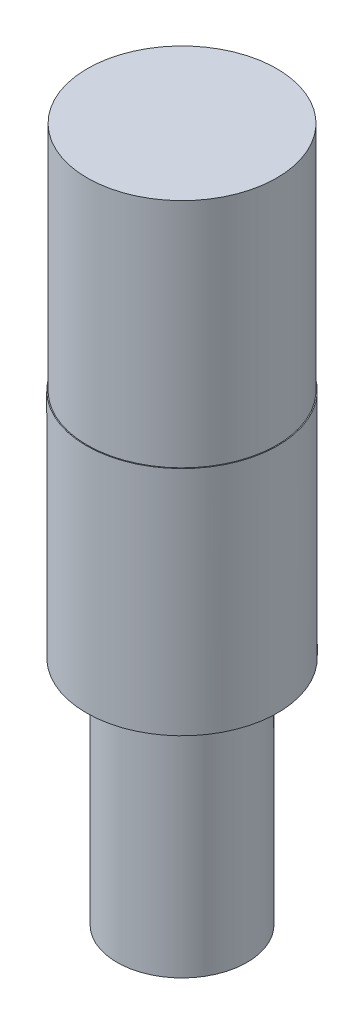
ISO-10303-21;
HEADER;
FILE_DESCRIPTION(('STEP AP214'),'2;1');
FILE_NAME('part.step','',(''),(''),'','','');
FILE_SCHEMA(('AUTOMOTIVE_DESIGN { 1 0 10303 214 1 1 1 1 }'));
ENDSEC;
DATA;
#1=APPLICATION_CONTEXT('core data for automotive mechanical design processes');
#2=APPLICATION_PROTOCOL_DEFINITION('international standard','automotive_design',2000,#1);
#3=PRODUCT_CONTEXT('',#1,'mechanical');
#4=PRODUCT('Part','Part','',(#3));
#5=PRODUCT_RELATED_PRODUCT_CATEGORY('part','',(#4));
#6=PRODUCT_DEFINITION_FORMATION('','',#4);
#7=PRODUCT_DEFINITION_CONTEXT('part definition',#1,'design');
#8=PRODUCT_DEFINITION('design','',#6,#7);
#9=PRODUCT_DEFINITION_SHAPE('','',#8);
#10=(LENGTH_UNIT() NAMED_UNIT(*) SI_UNIT(.MILLI.,.METRE.));
#11=(NAMED_UNIT(*) PLANE_ANGLE_UNIT() SI_UNIT($,.RADIAN.));
#12=(NAMED_UNIT(*) SI_UNIT($,.STERADIAN.) SOLID_ANGLE_UNIT());
#13=UNCERTAINTY_MEASURE_WITH_UNIT(LENGTH_MEASURE(1.E-05),#10,'distance_accuracy_value','');
#14=(GEOMETRIC_REPRESENTATION_CONTEXT(3) GLOBAL_UNCERTAINTY_ASSIGNED_CONTEXT((#13)) GLOBAL_UNIT_ASSIGNED_CONTEXT((#10,
#11,#12)) REPRESENTATION_CONTEXT('',''));
#15=CARTESIAN_POINT('',(0.,0.,0.));
#16=DIRECTION('',(0.,0.,1.));
#17=DIRECTION('',(1.,0.,0.));
#18=AXIS2_PLACEMENT_3D('',#15,#16,#17);
#19=CARTESIAN_POINT('',(0.,25.4,0.));
#20=DIRECTION('',(0.,1.,0.));
#21=DIRECTION('',(0.,0.,1.));
#22=AXIS2_PLACEMENT_3D('',#19,#20,#21);
#23=PLANE('',#22);
#24=CARTESIAN_POINT('',(0.,25.4,0.));
#25=DIRECTION('',(0.,1.,0.));
#26=DIRECTION('',(0.,0.,1.));
#27=AXIS2_PLACEMENT_3D('',#24,#25,#26);
#28=CIRCLE('',#27,5.2);
#29=CARTESIAN_POINT('',(0.,25.4,5.2));
#30=VERTEX_POINT('',#29);
#31=EDGE_CURVE('E10',#30,#30,#28,.T.);
#32=ORIENTED_EDGE('',*,*,#31,.F.);
#33=EDGE_LOOP('',(#32));
#34=FACE_BOUND('',#33,.T.);
#35=CARTESIAN_POINT('',(0.,25.4,0.));
#36=DIRECTION('',(0.,1.,0.));
#37=DIRECTION('',(0.,0.,1.));
#38=AXIS2_PLACEMENT_3D('',#35,#36,#37);
#39=CIRCLE('',#38,5.25);
#40=CARTESIAN_POINT('',(0.,25.4,5.25));
#41=VERTEX_POINT('',#40);
#42=EDGE_CURVE('E43',#41,#41,#39,.T.);
#43=ORIENTED_EDGE('',*,*,#42,.T.);
#44=EDGE_LOOP('',(#43));
#45=FACE_BOUND('',#44,.T.);
#46=ADVANCED_FACE('F32',(#34,#45),#23,.T.);
#47=CARTESIAN_POINT('',(0.,25.4,0.));
#48=DIRECTION('',(0.,1.,0.));
#49=DIRECTION('',(0.,0.,1.));
#50=AXIS2_PLACEMENT_3D('',#47,#48,#49);
#51=CYLINDRICAL_SURFACE('',#50,5.2);
#52=ORIENTED_EDGE('',*,*,#31,.T.);
#53=EDGE_LOOP('',(#52));
#54=FACE_BOUND('',#53,.T.);
#55=CARTESIAN_POINT('',(0.,38.1,0.));
#56=DIRECTION('',(0.,1.,0.));
#57=DIRECTION('',(0.,0.,1.));
#58=AXIS2_PLACEMENT_3D('',#55,#56,#57);
#59=CIRCLE('',#58,5.2);
#60=CARTESIAN_POINT('',(0.,38.1,5.2));
#61=VERTEX_POINT('',#60);
#62=EDGE_CURVE('E36',#61,#61,#59,.T.);
#63=ORIENTED_EDGE('',*,*,#62,.F.);
#64=EDGE_LOOP('',(#63));
#65=FACE_BOUND('',#64,.T.);
#66=ADVANCED_FACE('F75',(#54,#65),#51,.T.);
#67=CARTESIAN_POINT('',(0.,38.1,0.));
#68=DIRECTION('',(0.,1.,0.));
#69=DIRECTION('',(0.,0.,1.));
#70=AXIS2_PLACEMENT_3D('',#67,#68,#69);
#71=PLANE('',#70);
#72=ORIENTED_EDGE('',*,*,#62,.T.);
#73=EDGE_LOOP('',(#72));
#74=FACE_BOUND('',#73,.T.);
#75=ADVANCED_FACE('F70',(#74),#71,.T.);
#76=CARTESIAN_POINT('',(0.,12.7,0.));
#77=DIRECTION('',(0.,1.,0.));
#78=DIRECTION('',(0.,0.,1.));
#79=AXIS2_PLACEMENT_3D('',#76,#77,#78);
#80=CYLINDRICAL_SURFACE('',#79,5.25);
#81=CARTESIAN_POINT('',(0.,12.7,0.));
#82=DIRECTION('',(0.,-1.,0.));
#83=DIRECTION('',(0.,0.,-1.));
#84=AXIS2_PLACEMENT_3D('',#81,#82,#83);
#85=CIRCLE('',#84,5.25);
#86=CARTESIAN_POINT('',(0.,12.7,-5.25));
#87=VERTEX_POINT('',#86);
#88=EDGE_CURVE('E47',#87,#87,#85,.F.);
#89=ORIENTED_EDGE('',*,*,#88,.T.);
#90=EDGE_LOOP('',(#89));
#91=FACE_BOUND('',#90,.T.);
#92=ORIENTED_EDGE('',*,*,#42,.F.);
#93=EDGE_LOOP('',(#92));
#94=FACE_BOUND('',#93,.T.);
#95=ADVANCED_FACE('F62',(#91,#94),#80,.T.);
#96=CARTESIAN_POINT('',(0.,12.7,0.));
#97=DIRECTION('',(0.,-1.,0.));
#98=DIRECTION('',(0.,0.,-1.));
#99=AXIS2_PLACEMENT_3D('',#96,#97,#98);
#100=PLANE('',#99);
#101=ORIENTED_EDGE('',*,*,#88,.F.);
#102=EDGE_LOOP('',(#101));
#103=FACE_BOUND('',#102,.T.);
#104=CARTESIAN_POINT('',(0.,12.7,0.));
#105=DIRECTION('',(0.,-1.,0.));
#106=DIRECTION('',(0.,0.,-1.));
#107=AXIS2_PLACEMENT_3D('',#104,#105,#106);
#108=CIRCLE('',#107,3.5687);
#109=CARTESIAN_POINT('',(0.,12.7,-3.5687));
#110=VERTEX_POINT('',#109);
#111=EDGE_CURVE('E50',#110,#110,#108,.T.);
#112=ORIENTED_EDGE('',*,*,#111,.F.);
#113=EDGE_LOOP('',(#112));
#114=FACE_BOUND('',#113,.T.);
#115=ADVANCED_FACE('F60',(#103,#114),#100,.T.);
#116=CARTESIAN_POINT('',(0.,12.7,0.));
#117=DIRECTION('',(0.,-1.,0.));
#118=DIRECTION('',(0.,0.,-1.));
#119=AXIS2_PLACEMENT_3D('',#116,#117,#118);
#120=CYLINDRICAL_SURFACE('',#119,3.5687);
#121=ORIENTED_EDGE('',*,*,#111,.T.);
#122=EDGE_LOOP('',(#121));
#123=FACE_BOUND('',#122,.T.);
#124=CARTESIAN_POINT('',(0.,0.,0.));
#125=DIRECTION('',(0.,-1.,0.));
#126=DIRECTION('',(0.,0.,-1.));
#127=AXIS2_PLACEMENT_3D('',#124,#125,#126);
#128=CIRCLE('',#127,3.5687);
#129=CARTESIAN_POINT('',(0.,0.,-3.5687));
#130=VERTEX_POINT('',#129);
#131=EDGE_CURVE('E51',#130,#130,#128,.T.);
#132=ORIENTED_EDGE('',*,*,#131,.F.);
#133=EDGE_LOOP('',(#132));
#134=FACE_BOUND('',#133,.T.);
#135=ADVANCED_FACE('F57',(#123,#134),#120,.T.);
#136=CARTESIAN_POINT('',(0.,0.,0.));
#137=DIRECTION('',(0.,1.,0.));
#138=DIRECTION('',(0.,0.,1.));
#139=AXIS2_PLACEMENT_3D('',#136,#137,#138);
#140=PLANE('',#139);
#141=ORIENTED_EDGE('',*,*,#131,.T.);
#142=EDGE_LOOP('',(#141));
#143=FACE_BOUND('',#142,.T.);
#144=ADVANCED_FACE('F34',(#143),#140,.F.);
#145=CLOSED_SHELL('',(#46,#66,#75,#95,#115,#135,#144));
#146=MANIFOLD_SOLID_BREP('B2',#145);
#147=ADVANCED_BREP_SHAPE_REPRESENTATION('',(#18,#146),#14);
#148=SHAPE_DEFINITION_REPRESENTATION(#9,#147);
ENDSEC;
END-ISO-10303-21;
